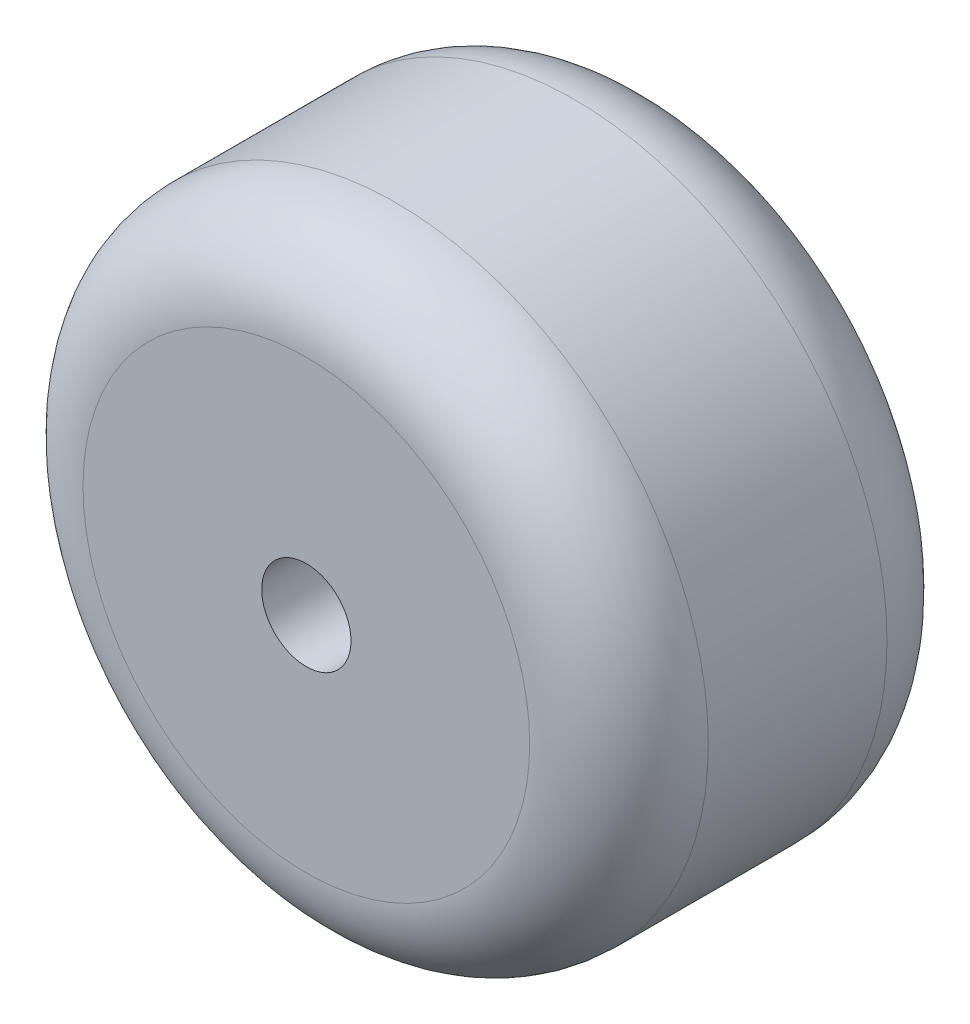
ISO-10303-21;
HEADER;
FILE_DESCRIPTION(('STEP AP214'),'2;1');
FILE_NAME('part.step','',(''),(''),'','','');
FILE_SCHEMA(('AUTOMOTIVE_DESIGN { 1 0 10303 214 1 1 1 1 }'));
ENDSEC;
DATA;
#1=APPLICATION_CONTEXT('core data for automotive mechanical design processes');
#2=APPLICATION_PROTOCOL_DEFINITION('international standard','automotive_design',2000,#1);
#3=PRODUCT_CONTEXT('',#1,'mechanical');
#4=PRODUCT('Part','Part','',(#3));
#5=PRODUCT_RELATED_PRODUCT_CATEGORY('part','',(#4));
#6=PRODUCT_DEFINITION_FORMATION('','',#4);
#7=PRODUCT_DEFINITION_CONTEXT('part definition',#1,'design');
#8=PRODUCT_DEFINITION('design','',#6,#7);
#9=PRODUCT_DEFINITION_SHAPE('','',#8);
#10=(LENGTH_UNIT() NAMED_UNIT(*) SI_UNIT(.MILLI.,.METRE.));
#11=(NAMED_UNIT(*) PLANE_ANGLE_UNIT() SI_UNIT($,.RADIAN.));
#12=(NAMED_UNIT(*) SI_UNIT($,.STERADIAN.) SOLID_ANGLE_UNIT());
#13=UNCERTAINTY_MEASURE_WITH_UNIT(LENGTH_MEASURE(1.E-05),#10,'distance_accuracy_value','');
#14=(GEOMETRIC_REPRESENTATION_CONTEXT(3) GLOBAL_UNCERTAINTY_ASSIGNED_CONTEXT((#13)) GLOBAL_UNIT_ASSIGNED_CONTEXT((#10,
#11,#12)) REPRESENTATION_CONTEXT('',''));
#15=CARTESIAN_POINT('',(0.,0.,0.));
#16=DIRECTION('',(0.,0.,1.));
#17=DIRECTION('',(1.,0.,0.));
#18=AXIS2_PLACEMENT_3D('',#15,#16,#17);
#19=CARTESIAN_POINT('',(0.,0.,40.));
#20=DIRECTION('',(0.,0.,-1.));
#21=DIRECTION('',(-1.,0.,0.));
#22=AXIS2_PLACEMENT_3D('',#19,#20,#21);
#23=CYLINDRICAL_SURFACE('',#22,35.);
#24=CARTESIAN_POINT('',(0.,0.,30.));
#25=DIRECTION('',(0.,0.,1.));
#26=DIRECTION('',(1.,0.,0.));
#27=AXIS2_PLACEMENT_3D('',#24,#25,#26);
#28=CIRCLE('',#27,35.);
#29=CARTESIAN_POINT('',(35.,0.,30.));
#30=VERTEX_POINT('',#29);
#31=EDGE_CURVE('E45',#30,#30,#28,.F.);
#32=ORIENTED_EDGE('',*,*,#31,.T.);
#33=EDGE_LOOP('',(#32));
#34=FACE_BOUND('',#33,.T.);
#35=CARTESIAN_POINT('',(0.,0.,10.));
#36=DIRECTION('',(0.,0.,1.));
#37=DIRECTION('',(1.,0.,0.));
#38=AXIS2_PLACEMENT_3D('',#35,#36,#37);
#39=CIRCLE('',#38,35.);
#40=CARTESIAN_POINT('',(35.,0.,10.));
#41=VERTEX_POINT('',#40);
#42=EDGE_CURVE('E50',#41,#41,#39,.T.);
#43=ORIENTED_EDGE('',*,*,#42,.T.);
#44=EDGE_LOOP('',(#43));
#45=FACE_BOUND('',#44,.T.);
#46=ADVANCED_FACE('F37',(#34,#45),#23,.T.);
#47=CARTESIAN_POINT('',(0.,0.,40.));
#48=DIRECTION('',(0.,0.,1.));
#49=DIRECTION('',(1.,0.,0.));
#50=AXIS2_PLACEMENT_3D('',#47,#48,#49);
#51=PLANE('',#50);
#52=CARTESIAN_POINT('',(0.,0.,40.));
#53=DIRECTION('',(0.,0.,1.));
#54=DIRECTION('',(1.,0.,0.));
#55=AXIS2_PLACEMENT_3D('',#52,#53,#54);
#56=CIRCLE('',#55,5.);
#57=CARTESIAN_POINT('',(5.,0.,40.));
#58=VERTEX_POINT('',#57);
#59=EDGE_CURVE('E62',#58,#58,#56,.T.);
#60=ORIENTED_EDGE('',*,*,#59,.F.);
#61=EDGE_LOOP('',(#60));
#62=FACE_BOUND('',#61,.T.);
#63=CARTESIAN_POINT('',(0.,0.,40.));
#64=DIRECTION('',(0.,0.,1.));
#65=DIRECTION('',(1.,0.,0.));
#66=AXIS2_PLACEMENT_3D('',#63,#64,#65);
#67=CIRCLE('',#66,25.);
#68=CARTESIAN_POINT('',(25.,0.,40.));
#69=VERTEX_POINT('',#68);
#70=EDGE_CURVE('E55',#69,#69,#67,.T.);
#71=ORIENTED_EDGE('',*,*,#70,.T.);
#72=EDGE_LOOP('',(#71));
#73=FACE_BOUND('',#72,.T.);
#74=ADVANCED_FACE('F78',(#62,#73),#51,.T.);
#75=CARTESIAN_POINT('',(0.,0.,0.));
#76=DIRECTION('',(0.,0.,1.));
#77=DIRECTION('',(1.,0.,0.));
#78=AXIS2_PLACEMENT_3D('',#75,#76,#77);
#79=PLANE('',#78);
#80=CARTESIAN_POINT('',(0.,0.,0.));
#81=DIRECTION('',(0.,0.,1.));
#82=DIRECTION('',(1.,0.,0.));
#83=AXIS2_PLACEMENT_3D('',#80,#81,#82);
#84=CIRCLE('',#83,5.);
#85=CARTESIAN_POINT('',(5.,0.,0.));
#86=VERTEX_POINT('',#85);
#87=EDGE_CURVE('E61',#86,#86,#84,.T.);
#88=ORIENTED_EDGE('',*,*,#87,.T.);
#89=EDGE_LOOP('',(#88));
#90=FACE_BOUND('',#89,.T.);
#91=CARTESIAN_POINT('',(0.,0.,0.));
#92=DIRECTION('',(0.,0.,1.));
#93=DIRECTION('',(1.,0.,0.));
#94=AXIS2_PLACEMENT_3D('',#91,#92,#93);
#95=CIRCLE('',#94,25.);
#96=CARTESIAN_POINT('',(25.,0.,0.));
#97=VERTEX_POINT('',#96);
#98=EDGE_CURVE('E10',#97,#97,#95,.F.);
#99=ORIENTED_EDGE('',*,*,#98,.T.);
#100=EDGE_LOOP('',(#99));
#101=FACE_BOUND('',#100,.T.);
#102=ADVANCED_FACE('F70',(#90,#101),#79,.F.);
#103=CARTESIAN_POINT('',(0.,0.,30.));
#104=DIRECTION('',(0.,0.,1.));
#105=DIRECTION('',(1.,0.,0.));
#106=AXIS2_PLACEMENT_3D('',#103,#104,#105);
#107=TOROIDAL_SURFACE('',#106,25.,10.);
#108=ORIENTED_EDGE('',*,*,#31,.F.);
#109=EDGE_LOOP('',(#108));
#110=FACE_BOUND('',#109,.T.);
#111=ORIENTED_EDGE('',*,*,#70,.F.);
#112=EDGE_LOOP('',(#111));
#113=FACE_BOUND('',#112,.T.);
#114=ADVANCED_FACE('F84',(#110,#113),#107,.T.);
#115=CARTESIAN_POINT('',(0.,0.,10.));
#116=DIRECTION('',(0.,0.,1.));
#117=DIRECTION('',(1.,0.,0.));
#118=AXIS2_PLACEMENT_3D('',#115,#116,#117);
#119=TOROIDAL_SURFACE('',#118,25.,10.);
#120=ORIENTED_EDGE('',*,*,#98,.F.);
#121=EDGE_LOOP('',(#120));
#122=FACE_BOUND('',#121,.T.);
#123=ORIENTED_EDGE('',*,*,#42,.F.);
#124=EDGE_LOOP('',(#123));
#125=FACE_BOUND('',#124,.T.);
#126=ADVANCED_FACE('F39',(#122,#125),#119,.T.);
#127=CARTESIAN_POINT('',(0.,0.,0.));
#128=DIRECTION('',(0.,0.,1.));
#129=DIRECTION('',(1.,0.,0.));
#130=AXIS2_PLACEMENT_3D('',#127,#128,#129);
#131=CYLINDRICAL_SURFACE('',#130,5.);
#132=ORIENTED_EDGE('',*,*,#87,.F.);
#133=EDGE_LOOP('',(#132));
#134=FACE_BOUND('',#133,.T.);
#135=ORIENTED_EDGE('',*,*,#59,.T.);
#136=EDGE_LOOP('',(#135));
#137=FACE_BOUND('',#136,.T.);
#138=ADVANCED_FACE('F72',(#134,#137),#131,.F.);
#139=CLOSED_SHELL('',(#46,#74,#102,#114,#126,#138));
#140=MANIFOLD_SOLID_BREP('B2',#139);
#141=ADVANCED_BREP_SHAPE_REPRESENTATION('',(#18,#140),#14);
#142=SHAPE_DEFINITION_REPRESENTATION(#9,#141);
ENDSEC;
END-ISO-10303-21;
